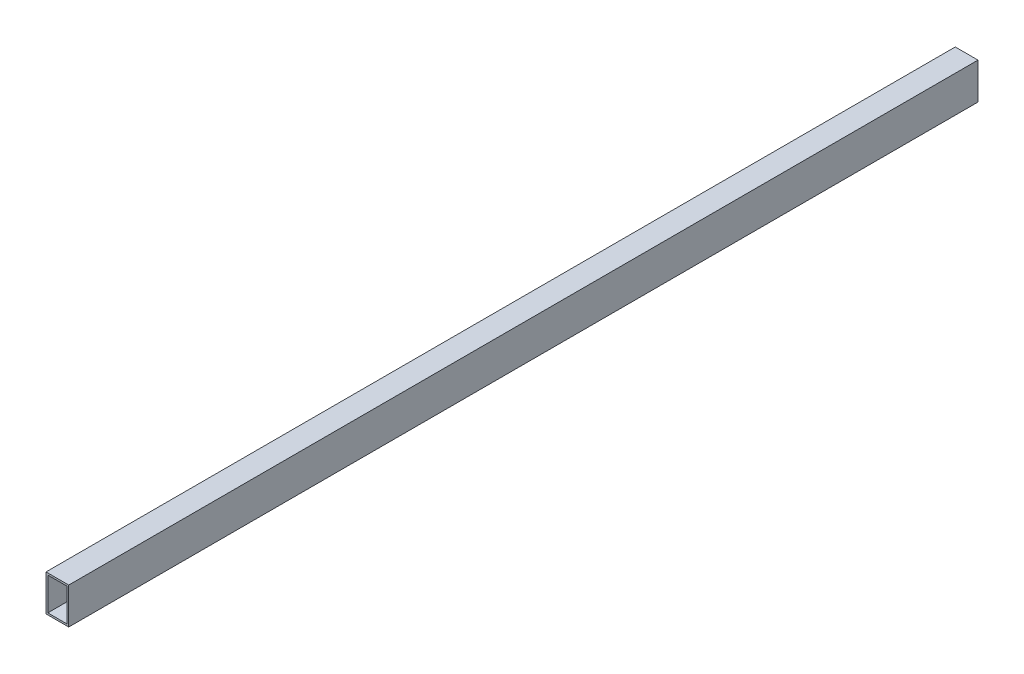
ISO-10303-21;
HEADER;
FILE_DESCRIPTION(('STEP AP214'),'2;1');
FILE_NAME('part.step','',(''),(''),'','','');
FILE_SCHEMA(('AUTOMOTIVE_DESIGN { 1 0 10303 214 1 1 1 1 }'));
ENDSEC;
DATA;
#1=APPLICATION_CONTEXT('core data for automotive mechanical design processes');
#2=APPLICATION_PROTOCOL_DEFINITION('international standard','automotive_design',2000,#1);
#3=PRODUCT_CONTEXT('',#1,'mechanical');
#4=PRODUCT('Part','Part','',(#3));
#5=PRODUCT_RELATED_PRODUCT_CATEGORY('part','',(#4));
#6=PRODUCT_DEFINITION_FORMATION('','',#4);
#7=PRODUCT_DEFINITION_CONTEXT('part definition',#1,'design');
#8=PRODUCT_DEFINITION('design','',#6,#7);
#9=PRODUCT_DEFINITION_SHAPE('','',#8);
#10=(LENGTH_UNIT() NAMED_UNIT(*) SI_UNIT(.MILLI.,.METRE.));
#11=(NAMED_UNIT(*) PLANE_ANGLE_UNIT() SI_UNIT($,.RADIAN.));
#12=(NAMED_UNIT(*) SI_UNIT($,.STERADIAN.) SOLID_ANGLE_UNIT());
#13=UNCERTAINTY_MEASURE_WITH_UNIT(LENGTH_MEASURE(1.E-05),#10,'distance_accuracy_value','');
#14=(GEOMETRIC_REPRESENTATION_CONTEXT(3) GLOBAL_UNCERTAINTY_ASSIGNED_CONTEXT((#13)) GLOBAL_UNIT_ASSIGNED_CONTEXT((#10,
#11,#12)) REPRESENTATION_CONTEXT('',''));
#15=CARTESIAN_POINT('',(0.,0.,0.));
#16=DIRECTION('',(0.,0.,1.));
#17=DIRECTION('',(1.,0.,0.));
#18=AXIS2_PLACEMENT_3D('',#15,#16,#17);
#19=CARTESIAN_POINT('',(-25.,40.,2000.));
#20=DIRECTION('',(1.,0.,0.));
#21=DIRECTION('',(0.,1.,0.));
#22=AXIS2_PLACEMENT_3D('',#19,#20,#21);
#23=PLANE('',#22);
#24=DIRECTION('',(0.,-1.,0.));
#25=VECTOR('',#24,1.);
#26=CARTESIAN_POINT('',(-25.,40.,0.));
#27=LINE('',#26,#25);
#28=CARTESIAN_POINT('',(-25.,40.,0.));
#29=VERTEX_POINT('',#28);
#30=CARTESIAN_POINT('',(-25.,-40.,0.));
#31=VERTEX_POINT('',#30);
#32=EDGE_CURVE('E131',#29,#31,#27,.T.);
#33=ORIENTED_EDGE('',*,*,#32,.T.);
#34=DIRECTION('',(0.,0.,-1.));
#35=VECTOR('',#34,1.);
#36=CARTESIAN_POINT('',(-25.,-40.,2000.));
#37=LINE('',#36,#35);
#38=CARTESIAN_POINT('',(-25.,-40.,2000.));
#39=VERTEX_POINT('',#38);
#40=EDGE_CURVE('E11',#39,#31,#37,.T.);
#41=ORIENTED_EDGE('',*,*,#40,.F.);
#42=DIRECTION('',(0.,-1.,0.));
#43=VECTOR('',#42,1.);
#44=CARTESIAN_POINT('',(-25.,40.,2000.));
#45=LINE('',#44,#43);
#46=CARTESIAN_POINT('',(-25.,40.,2000.));
#47=VERTEX_POINT('',#46);
#48=EDGE_CURVE('E135',#47,#39,#45,.T.);
#49=ORIENTED_EDGE('',*,*,#48,.F.);
#50=DIRECTION('',(0.,0.,-1.));
#51=VECTOR('',#50,1.);
#52=CARTESIAN_POINT('',(-25.,40.,2000.));
#53=LINE('',#52,#51);
#54=EDGE_CURVE('E147',#47,#29,#53,.T.);
#55=ORIENTED_EDGE('',*,*,#54,.T.);
#56=EDGE_LOOP('',(#33,#41,#49,#55));
#57=FACE_BOUND('',#56,.T.);
#58=ADVANCED_FACE('F34',(#57),#23,.F.);
#59=CARTESIAN_POINT('',(-25.,-40.,2000.));
#60=DIRECTION('',(0.,1.,0.));
#61=DIRECTION('',(0.,0.,1.));
#62=AXIS2_PLACEMENT_3D('',#59,#60,#61);
#63=PLANE('',#62);
#64=DIRECTION('',(1.,0.,0.));
#65=VECTOR('',#64,1.);
#66=CARTESIAN_POINT('',(-25.,-40.,0.));
#67=LINE('',#66,#65);
#68=CARTESIAN_POINT('',(25.,-40.,0.));
#69=VERTEX_POINT('',#68);
#70=EDGE_CURVE('E150',#31,#69,#67,.T.);
#71=ORIENTED_EDGE('',*,*,#70,.T.);
#72=DIRECTION('',(0.,0.,-1.));
#73=VECTOR('',#72,1.);
#74=CARTESIAN_POINT('',(25.,-40.,2000.));
#75=LINE('',#74,#73);
#76=CARTESIAN_POINT('',(25.,-40.,2000.));
#77=VERTEX_POINT('',#76);
#78=EDGE_CURVE('E41',#77,#69,#75,.T.);
#79=ORIENTED_EDGE('',*,*,#78,.F.);
#80=DIRECTION('',(1.,0.,0.));
#81=VECTOR('',#80,1.);
#82=CARTESIAN_POINT('',(-25.,-40.,2000.));
#83=LINE('',#82,#81);
#84=EDGE_CURVE('E138',#39,#77,#83,.T.);
#85=ORIENTED_EDGE('',*,*,#84,.F.);
#86=ORIENTED_EDGE('',*,*,#40,.T.);
#87=EDGE_LOOP('',(#71,#79,#85,#86));
#88=FACE_BOUND('',#87,.T.);
#89=ADVANCED_FACE('F166',(#88),#63,.F.);
#90=CARTESIAN_POINT('',(25.,40.,2000.));
#91=DIRECTION('',(1.,0.,0.));
#92=DIRECTION('',(0.,0.,-1.));
#93=AXIS2_PLACEMENT_3D('',#90,#91,#92);
#94=PLANE('',#93);
#95=DIRECTION('',(0.,-1.,0.));
#96=VECTOR('',#95,1.);
#97=CARTESIAN_POINT('',(25.,40.,0.));
#98=LINE('',#97,#96);
#99=CARTESIAN_POINT('',(25.,40.,0.));
#100=VERTEX_POINT('',#99);
#101=EDGE_CURVE('E153',#100,#69,#98,.T.);
#102=ORIENTED_EDGE('',*,*,#101,.F.);
#103=DIRECTION('',(0.,0.,-1.));
#104=VECTOR('',#103,1.);
#105=CARTESIAN_POINT('',(25.,40.,2000.));
#106=LINE('',#105,#104);
#107=CARTESIAN_POINT('',(25.,40.,2000.));
#108=VERTEX_POINT('',#107);
#109=EDGE_CURVE('E159',#108,#100,#106,.T.);
#110=ORIENTED_EDGE('',*,*,#109,.F.);
#111=DIRECTION('',(0.,-1.,0.));
#112=VECTOR('',#111,1.);
#113=CARTESIAN_POINT('',(25.,40.,2000.));
#114=LINE('',#113,#112);
#115=EDGE_CURVE('E141',#108,#77,#114,.T.);
#116=ORIENTED_EDGE('',*,*,#115,.T.);
#117=ORIENTED_EDGE('',*,*,#78,.T.);
#118=EDGE_LOOP('',(#102,#110,#116,#117));
#119=FACE_BOUND('',#118,.T.);
#120=ADVANCED_FACE('F163',(#119),#94,.T.);
#121=CARTESIAN_POINT('',(-25.,40.,2000.));
#122=DIRECTION('',(0.,1.,0.));
#123=DIRECTION('',(0.,0.,1.));
#124=AXIS2_PLACEMENT_3D('',#121,#122,#123);
#125=PLANE('',#124);
#126=DIRECTION('',(1.,0.,0.));
#127=VECTOR('',#126,1.);
#128=CARTESIAN_POINT('',(-25.,40.,0.));
#129=LINE('',#128,#127);
#130=EDGE_CURVE('E139',#29,#100,#129,.T.);
#131=ORIENTED_EDGE('',*,*,#130,.F.);
#132=ORIENTED_EDGE('',*,*,#54,.F.);
#133=DIRECTION('',(1.,0.,0.));
#134=VECTOR('',#133,1.);
#135=CARTESIAN_POINT('',(-25.,40.,2000.));
#136=LINE('',#135,#134);
#137=EDGE_CURVE('E144',#47,#108,#136,.T.);
#138=ORIENTED_EDGE('',*,*,#137,.T.);
#139=ORIENTED_EDGE('',*,*,#109,.T.);
#140=EDGE_LOOP('',(#131,#132,#138,#139));
#141=FACE_BOUND('',#140,.T.);
#142=ADVANCED_FACE('F173',(#141),#125,.T.);
#143=CARTESIAN_POINT('',(0.,0.,2000.));
#144=DIRECTION('',(0.,0.,1.));
#145=DIRECTION('',(1.,0.,0.));
#146=AXIS2_PLACEMENT_3D('',#143,#144,#145);
#147=PLANE('',#146);
#148=DIRECTION('',(0.,1.,0.));
#149=VECTOR('',#148,1.);
#150=CARTESIAN_POINT('',(-21.,36.,2000.));
#151=LINE('',#150,#149);
#152=CARTESIAN_POINT('',(-21.,-36.,2000.));
#153=VERTEX_POINT('',#152);
#154=CARTESIAN_POINT('',(-21.,36.,2000.));
#155=VERTEX_POINT('',#154);
#156=EDGE_CURVE('E100',#153,#155,#151,.T.);
#157=ORIENTED_EDGE('',*,*,#156,.T.);
#158=DIRECTION('',(1.,0.,0.));
#159=VECTOR('',#158,1.);
#160=CARTESIAN_POINT('',(21.,36.,2000.));
#161=LINE('',#160,#159);
#162=CARTESIAN_POINT('',(21.,36.,2000.));
#163=VERTEX_POINT('',#162);
#164=EDGE_CURVE('E109',#155,#163,#161,.T.);
#165=ORIENTED_EDGE('',*,*,#164,.T.);
#166=DIRECTION('',(0.,-1.,0.));
#167=VECTOR('',#166,1.);
#168=CARTESIAN_POINT('',(21.,36.,2000.));
#169=LINE('',#168,#167);
#170=CARTESIAN_POINT('',(21.,-36.,2000.));
#171=VERTEX_POINT('',#170);
#172=EDGE_CURVE('E48',#163,#171,#169,.T.);
#173=ORIENTED_EDGE('',*,*,#172,.T.);
#174=DIRECTION('',(-1.,0.,0.));
#175=VECTOR('',#174,1.);
#176=CARTESIAN_POINT('',(21.,-36.,2000.));
#177=LINE('',#176,#175);
#178=EDGE_CURVE('E106',#171,#153,#177,.T.);
#179=ORIENTED_EDGE('',*,*,#178,.T.);
#180=EDGE_LOOP('',(#157,#165,#173,#179));
#181=FACE_BOUND('',#180,.T.);
#182=ORIENTED_EDGE('',*,*,#48,.T.);
#183=ORIENTED_EDGE('',*,*,#84,.T.);
#184=ORIENTED_EDGE('',*,*,#115,.F.);
#185=ORIENTED_EDGE('',*,*,#137,.F.);
#186=EDGE_LOOP('',(#182,#183,#184,#185));
#187=FACE_BOUND('',#186,.T.);
#188=ADVANCED_FACE('F113',(#181,#187),#147,.T.);
#189=CARTESIAN_POINT('',(0.,0.,0.));
#190=DIRECTION('',(0.,0.,1.));
#191=DIRECTION('',(1.,0.,0.));
#192=AXIS2_PLACEMENT_3D('',#189,#190,#191);
#193=PLANE('',#192);
#194=DIRECTION('',(1.,0.,0.));
#195=VECTOR('',#194,1.);
#196=CARTESIAN_POINT('',(21.,36.,0.));
#197=LINE('',#196,#195);
#198=CARTESIAN_POINT('',(-21.,36.,0.));
#199=VERTEX_POINT('',#198);
#200=CARTESIAN_POINT('',(21.,36.,0.));
#201=VERTEX_POINT('',#200);
#202=EDGE_CURVE('E125',#199,#201,#197,.T.);
#203=ORIENTED_EDGE('',*,*,#202,.F.);
#204=DIRECTION('',(0.,1.,0.));
#205=VECTOR('',#204,1.);
#206=CARTESIAN_POINT('',(-21.,36.,0.));
#207=LINE('',#206,#205);
#208=CARTESIAN_POINT('',(-21.,-36.,0.));
#209=VERTEX_POINT('',#208);
#210=EDGE_CURVE('E56',#209,#199,#207,.T.);
#211=ORIENTED_EDGE('',*,*,#210,.F.);
#212=DIRECTION('',(-1.,0.,0.));
#213=VECTOR('',#212,1.);
#214=CARTESIAN_POINT('',(21.,-36.,0.));
#215=LINE('',#214,#213);
#216=CARTESIAN_POINT('',(21.,-36.,0.));
#217=VERTEX_POINT('',#216);
#218=EDGE_CURVE('E116',#217,#209,#215,.T.);
#219=ORIENTED_EDGE('',*,*,#218,.F.);
#220=DIRECTION('',(0.,-1.,0.));
#221=VECTOR('',#220,1.);
#222=CARTESIAN_POINT('',(21.,36.,0.));
#223=LINE('',#222,#221);
#224=EDGE_CURVE('E119',#201,#217,#223,.T.);
#225=ORIENTED_EDGE('',*,*,#224,.F.);
#226=EDGE_LOOP('',(#203,#211,#219,#225));
#227=FACE_BOUND('',#226,.T.);
#228=ORIENTED_EDGE('',*,*,#32,.F.);
#229=ORIENTED_EDGE('',*,*,#130,.T.);
#230=ORIENTED_EDGE('',*,*,#101,.T.);
#231=ORIENTED_EDGE('',*,*,#70,.F.);
#232=EDGE_LOOP('',(#228,#229,#230,#231));
#233=FACE_BOUND('',#232,.T.);
#234=ADVANCED_FACE('F170',(#227,#233),#193,.F.);
#235=CARTESIAN_POINT('',(-21.,36.,2000.));
#236=DIRECTION('',(-1.,0.,0.));
#237=DIRECTION('',(0.,-1.,0.));
#238=AXIS2_PLACEMENT_3D('',#235,#236,#237);
#239=PLANE('',#238);
#240=ORIENTED_EDGE('',*,*,#210,.T.);
#241=DIRECTION('',(0.,0.,-1.));
#242=VECTOR('',#241,1.);
#243=CARTESIAN_POINT('',(-21.,36.,2000.));
#244=LINE('',#243,#242);
#245=EDGE_CURVE('E96',#155,#199,#244,.T.);
#246=ORIENTED_EDGE('',*,*,#245,.F.);
#247=ORIENTED_EDGE('',*,*,#156,.F.);
#248=DIRECTION('',(0.,0.,-1.));
#249=VECTOR('',#248,1.);
#250=CARTESIAN_POINT('',(-21.,-36.,2000.));
#251=LINE('',#250,#249);
#252=EDGE_CURVE('E129',#153,#209,#251,.T.);
#253=ORIENTED_EDGE('',*,*,#252,.T.);
#254=EDGE_LOOP('',(#240,#246,#247,#253));
#255=FACE_BOUND('',#254,.T.);
#256=ADVANCED_FACE('F98',(#255),#239,.F.);
#257=CARTESIAN_POINT('',(21.,-36.,2000.));
#258=DIRECTION('',(0.,-1.,0.));
#259=DIRECTION('',(0.,0.,-1.));
#260=AXIS2_PLACEMENT_3D('',#257,#258,#259);
#261=PLANE('',#260);
#262=ORIENTED_EDGE('',*,*,#218,.T.);
#263=ORIENTED_EDGE('',*,*,#252,.F.);
#264=ORIENTED_EDGE('',*,*,#178,.F.);
#265=DIRECTION('',(0.,0.,-1.));
#266=VECTOR('',#265,1.);
#267=CARTESIAN_POINT('',(21.,-36.,2000.));
#268=LINE('',#267,#266);
#269=EDGE_CURVE('E132',#171,#217,#268,.T.);
#270=ORIENTED_EDGE('',*,*,#269,.T.);
#271=EDGE_LOOP('',(#262,#263,#264,#270));
#272=FACE_BOUND('',#271,.T.);
#273=ADVANCED_FACE('F195',(#272),#261,.F.);
#274=CARTESIAN_POINT('',(21.,36.,2000.));
#275=DIRECTION('',(1.,0.,0.));
#276=DIRECTION('',(0.,1.,0.));
#277=AXIS2_PLACEMENT_3D('',#274,#275,#276);
#278=PLANE('',#277);
#279=ORIENTED_EDGE('',*,*,#224,.T.);
#280=ORIENTED_EDGE('',*,*,#269,.F.);
#281=ORIENTED_EDGE('',*,*,#172,.F.);
#282=DIRECTION('',(0.,0.,-1.));
#283=VECTOR('',#282,1.);
#284=CARTESIAN_POINT('',(21.,36.,2000.));
#285=LINE('',#284,#283);
#286=EDGE_CURVE('E105',#163,#201,#285,.T.);
#287=ORIENTED_EDGE('',*,*,#286,.T.);
#288=EDGE_LOOP('',(#279,#280,#281,#287));
#289=FACE_BOUND('',#288,.T.);
#290=ADVANCED_FACE('F198',(#289),#278,.F.);
#291=CARTESIAN_POINT('',(21.,36.,2000.));
#292=DIRECTION('',(0.,1.,0.));
#293=DIRECTION('',(0.,0.,1.));
#294=AXIS2_PLACEMENT_3D('',#291,#292,#293);
#295=PLANE('',#294);
#296=ORIENTED_EDGE('',*,*,#202,.T.);
#297=ORIENTED_EDGE('',*,*,#286,.F.);
#298=ORIENTED_EDGE('',*,*,#164,.F.);
#299=ORIENTED_EDGE('',*,*,#245,.T.);
#300=EDGE_LOOP('',(#296,#297,#298,#299));
#301=FACE_BOUND('',#300,.T.);
#302=ADVANCED_FACE('F110',(#301),#295,.F.);
#303=CLOSED_SHELL('',(#58,#89,#120,#142,#188,#234,#256,#273,#290,#302));
#304=MANIFOLD_SOLID_BREP('B2',#303);
#305=ADVANCED_BREP_SHAPE_REPRESENTATION('',(#18,#304),#14);
#306=SHAPE_DEFINITION_REPRESENTATION(#9,#305);
ENDSEC;
END-ISO-10303-21;
